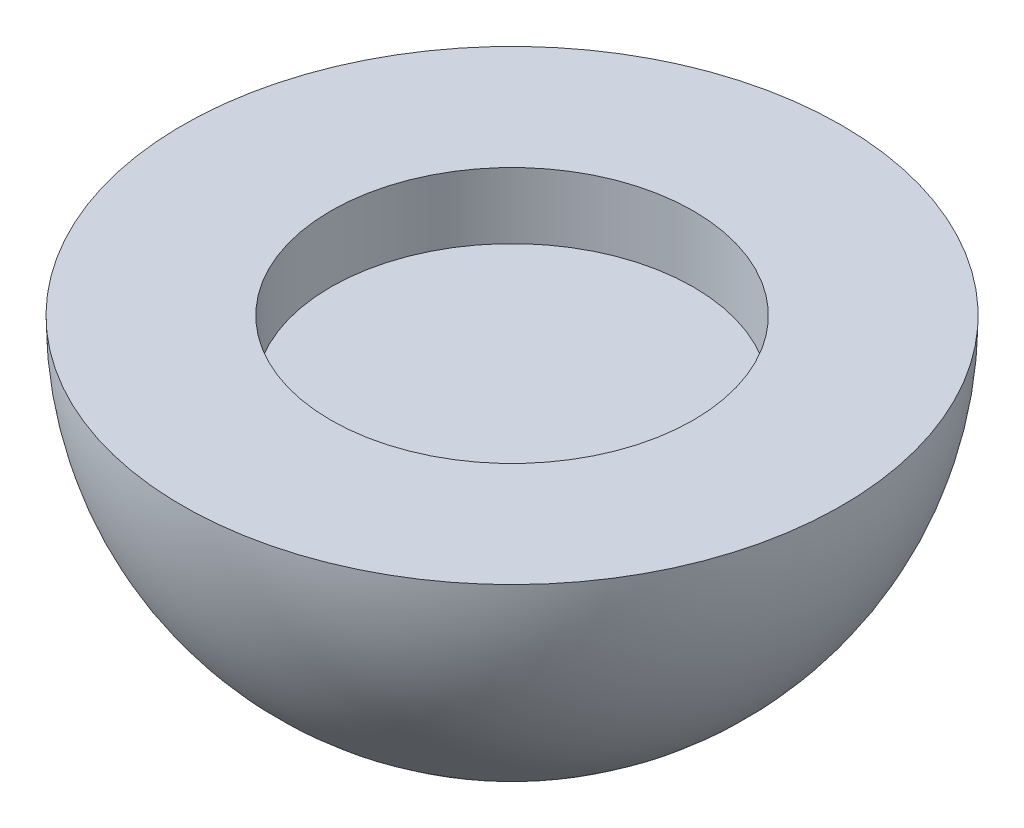
ISO-10303-21;
HEADER;
FILE_DESCRIPTION(('STEP AP214'),'2;1');
FILE_NAME('part.step','',(''),(''),'','','');
FILE_SCHEMA(('AUTOMOTIVE_DESIGN { 1 0 10303 214 1 1 1 1 }'));
ENDSEC;
DATA;
#1=APPLICATION_CONTEXT('core data for automotive mechanical design processes');
#2=APPLICATION_PROTOCOL_DEFINITION('international standard','automotive_design',2000,#1);
#3=PRODUCT_CONTEXT('',#1,'mechanical');
#4=PRODUCT('Part','Part','',(#3));
#5=PRODUCT_RELATED_PRODUCT_CATEGORY('part','',(#4));
#6=PRODUCT_DEFINITION_FORMATION('','',#4);
#7=PRODUCT_DEFINITION_CONTEXT('part definition',#1,'design');
#8=PRODUCT_DEFINITION('design','',#6,#7);
#9=PRODUCT_DEFINITION_SHAPE('','',#8);
#10=(LENGTH_UNIT() NAMED_UNIT(*) SI_UNIT(.MILLI.,.METRE.));
#11=(NAMED_UNIT(*) PLANE_ANGLE_UNIT() SI_UNIT($,.RADIAN.));
#12=(NAMED_UNIT(*) SI_UNIT($,.STERADIAN.) SOLID_ANGLE_UNIT());
#13=UNCERTAINTY_MEASURE_WITH_UNIT(LENGTH_MEASURE(1.E-05),#10,'distance_accuracy_value','');
#14=(GEOMETRIC_REPRESENTATION_CONTEXT(3) GLOBAL_UNCERTAINTY_ASSIGNED_CONTEXT((#13)) GLOBAL_UNIT_ASSIGNED_CONTEXT((#10,
#11,#12)) REPRESENTATION_CONTEXT('',''));
#15=CARTESIAN_POINT('',(0.,0.,0.));
#16=DIRECTION('',(0.,0.,1.));
#17=DIRECTION('',(1.,0.,0.));
#18=AXIS2_PLACEMENT_3D('',#15,#16,#17);
#19=CARTESIAN_POINT('',(0.,0.,0.));
#20=DIRECTION('',(1.,0.,0.));
#21=DIRECTION('',(0.,0.,-1.));
#22=AXIS2_PLACEMENT_3D('',#19,#20,#21);
#23=SPHERICAL_SURFACE('',#22,5.);
#24=CARTESIAN_POINT('',(0.,0.,0.));
#25=DIRECTION('',(0.,-1.,0.));
#26=DIRECTION('',(0.,0.,-1.));
#27=AXIS2_PLACEMENT_3D('',#24,#25,#26);
#28=SPHERICAL_SURFACE('',#27,5.);
#29=CARTESIAN_POINT('',(0.,0.,0.));
#30=DIRECTION('',(0.,-1.,0.));
#31=DIRECTION('',(0.,0.,-1.));
#32=AXIS2_PLACEMENT_3D('',#29,#30,#31);
#33=CIRCLE('',#32,5.);
#34=CARTESIAN_POINT('',(0.,0.,-5.));
#35=VERTEX_POINT('',#34);
#36=EDGE_CURVE('E10',#35,#35,#33,.T.);
#37=ORIENTED_EDGE('',*,*,#36,.T.);
#38=EDGE_LOOP('',(#37));
#39=FACE_BOUND('',#38,.T.);
#40=ADVANCED_FACE('F31',(#39),#28,.T.);
#41=CARTESIAN_POINT('',(0.,0.,0.));
#42=DIRECTION('',(0.,-1.,0.));
#43=DIRECTION('',(0.,0.,-1.));
#44=AXIS2_PLACEMENT_3D('',#41,#42,#43);
#45=PLANE('',#44);
#46=CARTESIAN_POINT('',(0.,0.,0.));
#47=DIRECTION('',(0.,1.,0.));
#48=DIRECTION('',(0.,0.,1.));
#49=AXIS2_PLACEMENT_3D('',#46,#47,#48);
#50=CIRCLE('',#49,2.75);
#51=CARTESIAN_POINT('',(0.,0.,2.75));
#52=VERTEX_POINT('',#51);
#53=EDGE_CURVE('E41',#52,#52,#50,.T.);
#54=ORIENTED_EDGE('',*,*,#53,.F.);
#55=EDGE_LOOP('',(#54));
#56=FACE_BOUND('',#55,.T.);
#57=ORIENTED_EDGE('',*,*,#36,.F.);
#58=EDGE_LOOP('',(#57));
#59=FACE_BOUND('',#58,.T.);
#60=ADVANCED_FACE('F50',(#56,#59),#45,.F.);
#61=CARTESIAN_POINT('',(0.,-1.,0.));
#62=DIRECTION('',(0.,1.,0.));
#63=DIRECTION('',(0.,0.,1.));
#64=AXIS2_PLACEMENT_3D('',#61,#62,#63);
#65=CYLINDRICAL_SURFACE('',#64,2.75);
#66=CARTESIAN_POINT('',(0.,-1.,0.));
#67=DIRECTION('',(0.,1.,0.));
#68=DIRECTION('',(0.,0.,1.));
#69=AXIS2_PLACEMENT_3D('',#66,#67,#68);
#70=CIRCLE('',#69,2.75);
#71=CARTESIAN_POINT('',(0.,-0.999999999999981,2.75000000000001));
#72=VERTEX_POINT('',#71);
#73=EDGE_CURVE('E37',#72,#72,#70,.T.);
#74=ORIENTED_EDGE('',*,*,#73,.F.);
#75=EDGE_LOOP('',(#74));
#76=FACE_BOUND('',#75,.T.);
#77=ORIENTED_EDGE('',*,*,#53,.T.);
#78=EDGE_LOOP('',(#77));
#79=FACE_BOUND('',#78,.T.);
#80=ADVANCED_FACE('F48',(#76,#79),#65,.F.);
#81=CARTESIAN_POINT('',(0.,-1.,0.));
#82=DIRECTION('',(0.,1.,0.));
#83=DIRECTION('',(0.,0.,1.));
#84=AXIS2_PLACEMENT_3D('',#81,#82,#83);
#85=PLANE('',#84);
#86=ORIENTED_EDGE('',*,*,#73,.T.);
#87=EDGE_LOOP('',(#86));
#88=FACE_BOUND('',#87,.T.);
#89=ADVANCED_FACE('F57',(#88),#85,.T.);
#90=CLOSED_SHELL('',(#40,#60,#80,#89));
#91=MANIFOLD_SOLID_BREP('B2',#90);
#92=ADVANCED_BREP_SHAPE_REPRESENTATION('',(#18,#91),#14);
#93=SHAPE_DEFINITION_REPRESENTATION(#9,#92);
ENDSEC;
END-ISO-10303-21;
